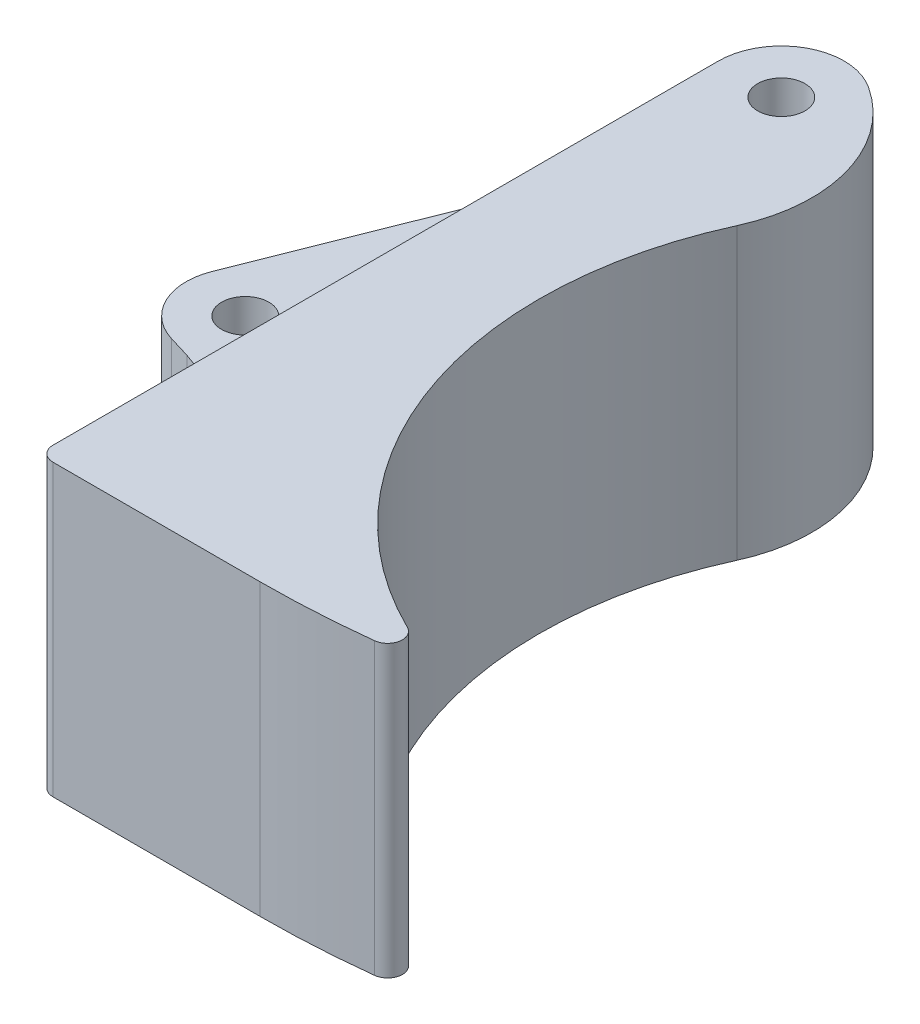
ISO-10303-21;
HEADER;
FILE_DESCRIPTION(('STEP AP214'),'2;1');
FILE_NAME('part.step','',(''),(''),'','','');
FILE_SCHEMA(('AUTOMOTIVE_DESIGN { 1 0 10303 214 1 1 1 1 }'));
ENDSEC;
DATA;
#1=APPLICATION_CONTEXT('core data for automotive mechanical design processes');
#2=APPLICATION_PROTOCOL_DEFINITION('international standard','automotive_design',2000,#1);
#3=PRODUCT_CONTEXT('',#1,'mechanical');
#4=PRODUCT('Part','Part','',(#3));
#5=PRODUCT_RELATED_PRODUCT_CATEGORY('part','',(#4));
#6=PRODUCT_DEFINITION_FORMATION('','',#4);
#7=PRODUCT_DEFINITION_CONTEXT('part definition',#1,'design');
#8=PRODUCT_DEFINITION('design','',#6,#7);
#9=PRODUCT_DEFINITION_SHAPE('','',#8);
#10=(LENGTH_UNIT() NAMED_UNIT(*) SI_UNIT(.MILLI.,.METRE.));
#11=(NAMED_UNIT(*) PLANE_ANGLE_UNIT() SI_UNIT($,.RADIAN.));
#12=(NAMED_UNIT(*) SI_UNIT($,.STERADIAN.) SOLID_ANGLE_UNIT());
#13=UNCERTAINTY_MEASURE_WITH_UNIT(LENGTH_MEASURE(1.E-05),#10,'distance_accuracy_value','');
#14=(GEOMETRIC_REPRESENTATION_CONTEXT(3) GLOBAL_UNCERTAINTY_ASSIGNED_CONTEXT((#13)) GLOBAL_UNIT_ASSIGNED_CONTEXT((#10,
#11,#12)) REPRESENTATION_CONTEXT('',''));
#15=CARTESIAN_POINT('',(0.,0.,0.));
#16=DIRECTION('',(0.,0.,1.));
#17=DIRECTION('',(1.,0.,0.));
#18=AXIS2_PLACEMENT_3D('',#15,#16,#17);
#19=CARTESIAN_POINT('',(0.,12.446,0.));
#20=DIRECTION('',(0.,1.,0.));
#21=DIRECTION('',(0.,0.,-1.));
#22=AXIS2_PLACEMENT_3D('',#19,#20,#21);
#23=PLANE('',#22);
#24=DIRECTION('',(-1.,0.,0.));
#25=VECTOR('',#24,1.);
#26=CARTESIAN_POINT('',(-5.39750000000001,12.446,58.42));
#27=LINE('',#26,#25);
#28=CARTESIAN_POINT('',(13.6525,12.446,58.42));
#29=VERTEX_POINT('',#28);
#30=CARTESIAN_POINT('',(-4.12750000000001,12.446,58.42));
#31=VERTEX_POINT('',#30);
#32=EDGE_CURVE('E203',#29,#31,#27,.T.);
#33=ORIENTED_EDGE('',*,*,#32,.F.);
#34=CARTESIAN_POINT('',(13.6525,12.446,-23.1899502882853));
#35=DIRECTION('',(0.,-1.,0.));
#36=DIRECTION('',(0.,0.,-1.));
#37=AXIS2_PLACEMENT_3D('',#34,#35,#36);
#38=CIRCLE('',#37,81.6099502882853);
#39=CARTESIAN_POINT('',(22.9595844996685,12.446,57.8875568525514));
#40=VERTEX_POINT('',#39);
#41=EDGE_CURVE('E201',#40,#29,#38,.T.);
#42=ORIENTED_EDGE('',*,*,#41,.F.);
#43=CARTESIAN_POINT('',(22.8147492525837,12.446,56.62584264117));
#44=DIRECTION('',(0.,-1.,0.));
#45=DIRECTION('',(0.,0.,-1.));
#46=AXIS2_PLACEMENT_3D('',#43,#44,#45);
#47=CIRCLE('',#46,1.27);
#48=CARTESIAN_POINT('',(23.3731145766902,12.446,55.485172590351));
#49=VERTEX_POINT('',#48);
#50=EDGE_CURVE('E257',#49,#40,#47,.T.);
#51=ORIENTED_EDGE('',*,*,#50,.F.);
#52=CARTESIAN_POINT('',(38.1,12.446,25.4));
#53=DIRECTION('',(0.,1.,0.));
#54=DIRECTION('',(0.,0.,-1.));
#55=AXIS2_PLACEMENT_3D('',#52,#53,#54);
#56=CIRCLE('',#55,33.49625);
#57=CARTESIAN_POINT('',(7.64307979127989,12.446,11.4581645590634));
#58=VERTEX_POINT('',#57);
#59=EDGE_CURVE('E199',#58,#49,#56,.T.);
#60=ORIENTED_EDGE('',*,*,#59,.F.);
#61=CARTESIAN_POINT('',(-3.90456768122061,12.446,6.1721606004144));
#62=DIRECTION('',(0.,-1.,0.));
#63=DIRECTION('',(0.,0.,-1.));
#64=AXIS2_PLACEMENT_3D('',#61,#62,#63);
#65=CIRCLE('',#64,12.7);
#66=CARTESIAN_POINT('',(3.06233772324981,12.446,-4.44632465338525));
#67=VERTEX_POINT('',#66);
#68=EDGE_CURVE('E237',#67,#58,#65,.T.);
#69=ORIENTED_EDGE('',*,*,#68,.F.);
#70=DIRECTION('',(0.836101201086587,0.,0.548575228698459));
#71=VECTOR('',#70,1.);
#72=CARTESIAN_POINT('',(2.96093479689993,12.446,-4.51285623286485));
#73=LINE('',#72,#71);
#74=CARTESIAN_POINT('',(2.96093479689993,12.446,-4.51285623286485));
#75=VERTEX_POINT('',#74);
#76=EDGE_CURVE('E196',#75,#67,#73,.T.);
#77=ORIENTED_EDGE('',*,*,#76,.F.);
#78=CARTESIAN_POINT('',(0.,12.446,0.));
#79=DIRECTION('',(0.,-1.,0.));
#80=DIRECTION('',(0.,0.,-1.));
#81=AXIS2_PLACEMENT_3D('',#78,#79,#80);
#82=CIRCLE('',#81,5.3975);
#83=CARTESIAN_POINT('',(-5.3975,12.446,0.));
#84=VERTEX_POINT('',#83);
#85=EDGE_CURVE('E192',#84,#75,#82,.T.);
#86=ORIENTED_EDGE('',*,*,#85,.F.);
#87=DIRECTION('',(0.,0.,-1.));
#88=VECTOR('',#87,1.);
#89=CARTESIAN_POINT('',(-5.39750000000001,12.446,58.42));
#90=LINE('',#89,#88);
#91=CARTESIAN_POINT('',(-5.39750000000001,12.446,57.15));
#92=VERTEX_POINT('',#91);
#93=EDGE_CURVE('E189',#92,#84,#90,.T.);
#94=ORIENTED_EDGE('',*,*,#93,.F.);
#95=CARTESIAN_POINT('',(-4.12750000000001,12.446,57.15));
#96=DIRECTION('',(0.,-1.,0.));
#97=DIRECTION('',(0.,0.,-1.));
#98=AXIS2_PLACEMENT_3D('',#95,#96,#97);
#99=CIRCLE('',#98,1.27);
#100=EDGE_CURVE('E259',#31,#92,#99,.T.);
#101=ORIENTED_EDGE('',*,*,#100,.F.);
#102=EDGE_LOOP('',(#33,#42,#51,#60,#69,#77,#86,#94,#101));
#103=FACE_BOUND('',#102,.T.);
#104=CARTESIAN_POINT('',(0.,12.446,0.));
#105=DIRECTION('',(0.,-1.,0.));
#106=DIRECTION('',(0.,0.,-1.));
#107=AXIS2_PLACEMENT_3D('',#104,#105,#106);
#108=CIRCLE('',#107,2.032);
#109=CARTESIAN_POINT('',(0.,12.446,-2.032));
#110=VERTEX_POINT('',#109);
#111=EDGE_CURVE('E183',#110,#110,#108,.T.);
#112=ORIENTED_EDGE('',*,*,#111,.T.);
#113=EDGE_LOOP('',(#112));
#114=FACE_BOUND('',#113,.T.);
#115=ADVANCED_FACE('F41',(#103,#114),#23,.T.);
#116=CARTESIAN_POINT('',(0.,-12.446,0.));
#117=DIRECTION('',(0.,1.,0.));
#118=DIRECTION('',(0.,0.,-1.));
#119=AXIS2_PLACEMENT_3D('',#116,#117,#118);
#120=PLANE('',#119);
#121=DIRECTION('',(0.,0.,-1.));
#122=VECTOR('',#121,1.);
#123=CARTESIAN_POINT('',(-5.39750000000001,-12.446,58.42));
#124=LINE('',#123,#122);
#125=CARTESIAN_POINT('',(-5.39750000000001,-12.446,57.15));
#126=VERTEX_POINT('',#125);
#127=CARTESIAN_POINT('',(-5.3975,-12.446,0.));
#128=VERTEX_POINT('',#127);
#129=EDGE_CURVE('E186',#126,#128,#124,.T.);
#130=ORIENTED_EDGE('',*,*,#129,.T.);
#131=CARTESIAN_POINT('',(0.,-12.446,0.));
#132=DIRECTION('',(0.,-1.,0.));
#133=DIRECTION('',(0.,0.,-1.));
#134=AXIS2_PLACEMENT_3D('',#131,#132,#133);
#135=CIRCLE('',#134,5.3975);
#136=CARTESIAN_POINT('',(2.96093479689993,-12.446,-4.51285623286485));
#137=VERTEX_POINT('',#136);
#138=EDGE_CURVE('E209',#128,#137,#135,.T.);
#139=ORIENTED_EDGE('',*,*,#138,.T.);
#140=DIRECTION('',(0.836101201086587,0.,0.548575228698459));
#141=VECTOR('',#140,1.);
#142=CARTESIAN_POINT('',(2.96093479689993,-12.446,-4.51285623286485));
#143=LINE('',#142,#141);
#144=CARTESIAN_POINT('',(3.06233772324981,-12.446,-4.44632465338525));
#145=VERTEX_POINT('',#144);
#146=EDGE_CURVE('E212',#137,#145,#143,.T.);
#147=ORIENTED_EDGE('',*,*,#146,.T.);
#148=CARTESIAN_POINT('',(-3.90456768122061,-12.446,6.1721606004144));
#149=DIRECTION('',(0.,-1.,0.));
#150=DIRECTION('',(0.,0.,-1.));
#151=AXIS2_PLACEMENT_3D('',#148,#149,#150);
#152=CIRCLE('',#151,12.7);
#153=CARTESIAN_POINT('',(7.64307979127989,-12.446,11.4581645590634));
#154=VERTEX_POINT('',#153);
#155=EDGE_CURVE('E232',#154,#145,#152,.F.);
#156=ORIENTED_EDGE('',*,*,#155,.F.);
#157=CARTESIAN_POINT('',(38.1,-12.446,25.4));
#158=DIRECTION('',(0.,1.,0.));
#159=DIRECTION('',(0.,0.,-1.));
#160=AXIS2_PLACEMENT_3D('',#157,#158,#159);
#161=CIRCLE('',#160,33.49625);
#162=CARTESIAN_POINT('',(23.3731145766902,-12.446,55.485172590351));
#163=VERTEX_POINT('',#162);
#164=EDGE_CURVE('E215',#154,#163,#161,.T.);
#165=ORIENTED_EDGE('',*,*,#164,.T.);
#166=CARTESIAN_POINT('',(22.8147492525837,-12.446,56.62584264117));
#167=DIRECTION('',(0.,-1.,0.));
#168=DIRECTION('',(0.,0.,-1.));
#169=AXIS2_PLACEMENT_3D('',#166,#167,#168);
#170=CIRCLE('',#169,1.27);
#171=CARTESIAN_POINT('',(22.9595844996685,-12.446,57.8875568525514));
#172=VERTEX_POINT('',#171);
#173=EDGE_CURVE('E250',#172,#163,#170,.F.);
#174=ORIENTED_EDGE('',*,*,#173,.F.);
#175=CARTESIAN_POINT('',(13.6525,-12.446,-23.1899502882853));
#176=DIRECTION('',(0.,-1.,0.));
#177=DIRECTION('',(0.,0.,-1.));
#178=AXIS2_PLACEMENT_3D('',#175,#176,#177);
#179=CIRCLE('',#178,81.6099502882853);
#180=CARTESIAN_POINT('',(13.6525,-12.446,58.42));
#181=VERTEX_POINT('',#180);
#182=EDGE_CURVE('E218',#172,#181,#179,.T.);
#183=ORIENTED_EDGE('',*,*,#182,.T.);
#184=DIRECTION('',(-1.,0.,0.));
#185=VECTOR('',#184,1.);
#186=CARTESIAN_POINT('',(-5.39750000000001,-12.446,58.42));
#187=LINE('',#186,#185);
#188=CARTESIAN_POINT('',(-4.12750000000001,-12.446,58.42));
#189=VERTEX_POINT('',#188);
#190=EDGE_CURVE('E193',#181,#189,#187,.T.);
#191=ORIENTED_EDGE('',*,*,#190,.T.);
#192=CARTESIAN_POINT('',(-4.12750000000001,-12.446,57.15));
#193=DIRECTION('',(0.,-1.,0.));
#194=DIRECTION('',(0.,0.,-1.));
#195=AXIS2_PLACEMENT_3D('',#192,#193,#194);
#196=CIRCLE('',#195,1.27);
#197=EDGE_CURVE('E252',#126,#189,#196,.F.);
#198=ORIENTED_EDGE('',*,*,#197,.F.);
#199=EDGE_LOOP('',(#130,#139,#147,#156,#165,#174,#183,#191,#198));
#200=FACE_BOUND('',#199,.T.);
#201=CARTESIAN_POINT('',(0.,-12.446,0.));
#202=DIRECTION('',(0.,-1.,0.));
#203=DIRECTION('',(0.,0.,-1.));
#204=AXIS2_PLACEMENT_3D('',#201,#202,#203);
#205=CIRCLE('',#204,2.032);
#206=CARTESIAN_POINT('',(0.,-12.446,-2.032));
#207=VERTEX_POINT('',#206);
#208=EDGE_CURVE('E151',#207,#207,#205,.T.);
#209=ORIENTED_EDGE('',*,*,#208,.F.);
#210=EDGE_LOOP('',(#209));
#211=FACE_BOUND('',#210,.T.);
#212=ADVANCED_FACE('F267',(#200,#211),#120,.F.);
#213=CARTESIAN_POINT('',(-5.39750000000001,12.446,58.42));
#214=DIRECTION('',(1.,0.,0.));
#215=DIRECTION('',(0.,0.,1.));
#216=AXIS2_PLACEMENT_3D('',#213,#214,#215);
#217=PLANE('',#216);
#218=ORIENTED_EDGE('',*,*,#93,.T.);
#219=DIRECTION('',(0.,-1.,0.));
#220=VECTOR('',#219,1.);
#221=CARTESIAN_POINT('',(-5.3975,12.446,0.));
#222=LINE('',#221,#220);
#223=CARTESIAN_POINT('',(-5.3975,6.19125,0.));
#224=VERTEX_POINT('',#223);
#225=EDGE_CURVE('E227',#84,#224,#222,.T.);
#226=ORIENTED_EDGE('',*,*,#225,.T.);
#227=DIRECTION('',(0.,0.,1.));
#228=VECTOR('',#227,1.);
#229=CARTESIAN_POINT('',(-5.39750000000001,6.19125,40.64));
#230=LINE('',#229,#228);
#231=CARTESIAN_POINT('',(-5.39750000000001,6.19125,48.1752390496232));
#232=VERTEX_POINT('',#231);
#233=EDGE_CURVE('E160',#224,#232,#230,.T.);
#234=ORIENTED_EDGE('',*,*,#233,.T.);
#235=DIRECTION('',(0.,-1.,0.));
#236=VECTOR('',#235,1.);
#237=CARTESIAN_POINT('',(-5.39750000000001,6.19125,48.1752390496232));
#238=LINE('',#237,#236);
#239=CARTESIAN_POINT('',(-5.39750000000001,-6.19125,48.1752390496232));
#240=VERTEX_POINT('',#239);
#241=EDGE_CURVE('E241',#240,#232,#238,.F.);
#242=ORIENTED_EDGE('',*,*,#241,.F.);
#243=DIRECTION('',(0.,0.,1.));
#244=VECTOR('',#243,1.);
#245=CARTESIAN_POINT('',(-5.39750000000001,-6.19125,40.64));
#246=LINE('',#245,#244);
#247=CARTESIAN_POINT('',(-5.3975,-6.19125,0.));
#248=VERTEX_POINT('',#247);
#249=EDGE_CURVE('E171',#248,#240,#246,.T.);
#250=ORIENTED_EDGE('',*,*,#249,.F.);
#251=EDGE_CURVE('E226',#248,#128,#222,.T.);
#252=ORIENTED_EDGE('',*,*,#251,.T.);
#253=ORIENTED_EDGE('',*,*,#129,.F.);
#254=DIRECTION('',(0.,-1.,0.));
#255=VECTOR('',#254,1.);
#256=CARTESIAN_POINT('',(-5.39750000000001,12.446,57.15));
#257=LINE('',#256,#255);
#258=EDGE_CURVE('E248',#92,#126,#257,.T.);
#259=ORIENTED_EDGE('',*,*,#258,.F.);
#260=EDGE_LOOP('',(#218,#226,#234,#242,#250,#252,#253,#259));
#261=FACE_BOUND('',#260,.T.);
#262=ADVANCED_FACE('F286',(#261),#217,.F.);
#263=CARTESIAN_POINT('',(0.,12.446,0.));
#264=DIRECTION('',(0.,-1.,0.));
#265=DIRECTION('',(0.,0.,1.));
#266=AXIS2_PLACEMENT_3D('',#263,#264,#265);
#267=CYLINDRICAL_SURFACE('',#266,5.3975);
#268=ORIENTED_EDGE('',*,*,#138,.F.);
#269=ORIENTED_EDGE('',*,*,#251,.F.);
#270=DIRECTION('',(0.,-1.,0.));
#271=VECTOR('',#270,1.);
#272=CARTESIAN_POINT('',(-5.3975,6.19125,0.));
#273=LINE('',#272,#271);
#274=EDGE_CURVE('E167',#224,#248,#273,.T.);
#275=ORIENTED_EDGE('',*,*,#274,.F.);
#276=ORIENTED_EDGE('',*,*,#225,.F.);
#277=ORIENTED_EDGE('',*,*,#85,.T.);
#278=DIRECTION('',(0.,-1.,0.));
#279=VECTOR('',#278,1.);
#280=CARTESIAN_POINT('',(2.96093479689993,12.446,-4.51285623286485));
#281=LINE('',#280,#279);
#282=EDGE_CURVE('E224',#75,#137,#281,.T.);
#283=ORIENTED_EDGE('',*,*,#282,.T.);
#284=EDGE_LOOP('',(#268,#269,#275,#276,#277,#283));
#285=FACE_BOUND('',#284,.T.);
#286=ADVANCED_FACE('F293',(#285),#267,.T.);
#287=CARTESIAN_POINT('',(2.96093479689993,12.446,-4.51285623286485));
#288=DIRECTION('',(-0.548575228698459,0.,0.836101201086587));
#289=DIRECTION('',(-0.836101201086587,0.,-0.548575228698459));
#290=AXIS2_PLACEMENT_3D('',#287,#288,#289);
#291=PLANE('',#290);
#292=ORIENTED_EDGE('',*,*,#146,.F.);
#293=ORIENTED_EDGE('',*,*,#282,.F.);
#294=ORIENTED_EDGE('',*,*,#76,.T.);
#295=DIRECTION('',(0.,-1.,0.));
#296=VECTOR('',#295,1.);
#297=CARTESIAN_POINT('',(3.06233772324981,12.446,-4.44632465338525));
#298=LINE('',#297,#296);
#299=EDGE_CURVE('E235',#145,#67,#298,.F.);
#300=ORIENTED_EDGE('',*,*,#299,.F.);
#301=EDGE_LOOP('',(#292,#293,#294,#300));
#302=FACE_BOUND('',#301,.T.);
#303=ADVANCED_FACE('F296',(#302),#291,.F.);
#304=CARTESIAN_POINT('',(38.1,12.446,25.4));
#305=DIRECTION('',(0.,-1.,0.));
#306=DIRECTION('',(0.,0.,1.));
#307=AXIS2_PLACEMENT_3D('',#304,#305,#306);
#308=CYLINDRICAL_SURFACE('',#307,33.49625);
#309=ORIENTED_EDGE('',*,*,#164,.F.);
#310=DIRECTION('',(0.,-1.,0.));
#311=VECTOR('',#310,1.);
#312=CARTESIAN_POINT('',(7.64307979127989,12.446,11.4581645590634));
#313=LINE('',#312,#311);
#314=EDGE_CURVE('E230',#58,#154,#313,.T.);
#315=ORIENTED_EDGE('',*,*,#314,.F.);
#316=ORIENTED_EDGE('',*,*,#59,.T.);
#317=DIRECTION('',(0.,-1.,0.));
#318=VECTOR('',#317,1.);
#319=CARTESIAN_POINT('',(23.3731145766902,12.446,55.485172590351));
#320=LINE('',#319,#318);
#321=EDGE_CURVE('E11',#163,#49,#320,.F.);
#322=ORIENTED_EDGE('',*,*,#321,.F.);
#323=EDGE_LOOP('',(#309,#315,#316,#322));
#324=FACE_BOUND('',#323,.T.);
#325=ADVANCED_FACE('F272',(#324),#308,.F.);
#326=CARTESIAN_POINT('',(13.6525,12.446,-23.1899502882853));
#327=DIRECTION('',(0.,-1.,0.));
#328=DIRECTION('',(0.,0.,1.));
#329=AXIS2_PLACEMENT_3D('',#326,#327,#328);
#330=CYLINDRICAL_SURFACE('',#329,81.6099502882853);
#331=ORIENTED_EDGE('',*,*,#41,.T.);
#332=DIRECTION('',(0.,-1.,0.));
#333=VECTOR('',#332,1.);
#334=CARTESIAN_POINT('',(13.6525,12.446,58.42));
#335=LINE('',#334,#333);
#336=EDGE_CURVE('E206',#29,#181,#335,.T.);
#337=ORIENTED_EDGE('',*,*,#336,.T.);
#338=ORIENTED_EDGE('',*,*,#182,.F.);
#339=DIRECTION('',(0.,-1.,0.));
#340=VECTOR('',#339,1.);
#341=CARTESIAN_POINT('',(22.9595844996685,12.446,57.8875568525514));
#342=LINE('',#341,#340);
#343=EDGE_CURVE('E49',#40,#172,#342,.T.);
#344=ORIENTED_EDGE('',*,*,#343,.F.);
#345=EDGE_LOOP('',(#331,#337,#338,#344));
#346=FACE_BOUND('',#345,.T.);
#347=ADVANCED_FACE('F264',(#346),#330,.T.);
#348=CARTESIAN_POINT('',(-5.39750000000001,12.446,58.42));
#349=DIRECTION('',(0.,0.,-1.));
#350=DIRECTION('',(1.,0.,0.));
#351=AXIS2_PLACEMENT_3D('',#348,#349,#350);
#352=PLANE('',#351);
#353=ORIENTED_EDGE('',*,*,#190,.F.);
#354=ORIENTED_EDGE('',*,*,#336,.F.);
#355=ORIENTED_EDGE('',*,*,#32,.T.);
#356=DIRECTION('',(0.,-1.,0.));
#357=VECTOR('',#356,1.);
#358=CARTESIAN_POINT('',(-4.12750000000001,12.446,58.42));
#359=LINE('',#358,#357);
#360=EDGE_CURVE('E255',#189,#31,#359,.F.);
#361=ORIENTED_EDGE('',*,*,#360,.F.);
#362=EDGE_LOOP('',(#353,#354,#355,#361));
#363=FACE_BOUND('',#362,.T.);
#364=ADVANCED_FACE('F281',(#363),#352,.F.);
#365=CARTESIAN_POINT('',(0.,12.446,0.));
#366=DIRECTION('',(0.,-1.,0.));
#367=DIRECTION('',(0.,0.,1.));
#368=AXIS2_PLACEMENT_3D('',#365,#366,#367);
#369=CYLINDRICAL_SURFACE('',#368,2.032);
#370=ORIENTED_EDGE('',*,*,#111,.F.);
#371=EDGE_LOOP('',(#370));
#372=FACE_BOUND('',#371,.T.);
#373=ORIENTED_EDGE('',*,*,#208,.T.);
#374=EDGE_LOOP('',(#373));
#375=FACE_BOUND('',#374,.T.);
#376=ADVANCED_FACE('F335',(#372,#375),#369,.F.);
#377=CARTESIAN_POINT('',(-3.90456768122061,12.446,6.1721606004144));
#378=DIRECTION('',(0.,-1.,0.));
#379=DIRECTION('',(0.,0.,1.));
#380=AXIS2_PLACEMENT_3D('',#377,#378,#379);
#381=CYLINDRICAL_SURFACE('',#380,12.7);
#382=ORIENTED_EDGE('',*,*,#68,.T.);
#383=ORIENTED_EDGE('',*,*,#314,.T.);
#384=ORIENTED_EDGE('',*,*,#155,.T.);
#385=ORIENTED_EDGE('',*,*,#299,.T.);
#386=EDGE_LOOP('',(#382,#383,#384,#385));
#387=FACE_BOUND('',#386,.T.);
#388=ADVANCED_FACE('F299',(#387),#381,.T.);
#389=CARTESIAN_POINT('',(-13.0175,6.19125,33.02));
#390=DIRECTION('',(0.,1.,0.));
#391=DIRECTION('',(0.,0.,-1.));
#392=AXIS2_PLACEMENT_3D('',#389,#390,#391);
#393=PLANE('',#392);
#394=ORIENTED_EDGE('',*,*,#233,.F.);
#395=DIRECTION('',(0.36838605547651,0.,-0.929672907064876));
#396=VECTOR('',#395,1.);
#397=CARTESIAN_POINT('',(-5.3975,6.19125,0.));
#398=LINE('',#397,#396);
#399=CARTESIAN_POINT('',(-17.7402383678896,6.19125,31.1485988381793));
#400=VERTEX_POINT('',#399);
#401=EDGE_CURVE('E165',#400,#224,#398,.T.);
#402=ORIENTED_EDGE('',*,*,#401,.F.);
#403=CARTESIAN_POINT('',(-13.0175,6.19125,33.02));
#404=DIRECTION('',(0.,-1.,0.));
#405=DIRECTION('',(0.,0.,-1.));
#406=AXIS2_PLACEMENT_3D('',#403,#404,#405);
#407=CIRCLE('',#406,5.08);
#408=CARTESIAN_POINT('',(-14.4921032541353,6.19125,37.8812699208019));
#409=VERTEX_POINT('',#408);
#410=EDGE_CURVE('E144',#409,#400,#407,.T.);
#411=ORIENTED_EDGE('',*,*,#410,.F.);
#412=DIRECTION('',(-0.956942897795657,0.,-0.29027623112899));
#413=VECTOR('',#412,1.);
#414=CARTESIAN_POINT('',(-5.39750000000001,6.19125,40.64));
#415=LINE('',#414,#413);
#416=CARTESIAN_POINT('',(-12.6082934917295,6.19125,38.4526992080194));
#417=VERTEX_POINT('',#416);
#418=EDGE_CURVE('E155',#417,#409,#415,.T.);
#419=ORIENTED_EDGE('',*,*,#418,.F.);
#420=CARTESIAN_POINT('',(-15.5575,6.19125,48.1752390496232));
#421=DIRECTION('',(0.,-1.,0.));
#422=DIRECTION('',(0.,0.,-1.));
#423=AXIS2_PLACEMENT_3D('',#420,#421,#422);
#424=CIRCLE('',#423,10.16);
#425=EDGE_CURVE('E246',#232,#417,#424,.F.);
#426=ORIENTED_EDGE('',*,*,#425,.F.);
#427=EDGE_LOOP('',(#394,#402,#411,#419,#426));
#428=FACE_BOUND('',#427,.T.);
#429=CARTESIAN_POINT('',(-13.0175,6.19125,33.02));
#430=DIRECTION('',(0.,-1.,0.));
#431=DIRECTION('',(0.,0.,-1.));
#432=AXIS2_PLACEMENT_3D('',#429,#430,#431);
#433=CIRCLE('',#432,2.032);
#434=CARTESIAN_POINT('',(-13.0175,6.19125,30.988));
#435=VERTEX_POINT('',#434);
#436=EDGE_CURVE('E175',#435,#435,#433,.T.);
#437=ORIENTED_EDGE('',*,*,#436,.T.);
#438=EDGE_LOOP('',(#437));
#439=FACE_BOUND('',#438,.T.);
#440=ADVANCED_FACE('F163',(#428,#439),#393,.T.);
#441=CARTESIAN_POINT('',(-13.0175,-6.19125,33.02));
#442=DIRECTION('',(0.,1.,0.));
#443=DIRECTION('',(0.,0.,-1.));
#444=AXIS2_PLACEMENT_3D('',#441,#442,#443);
#445=PLANE('',#444);
#446=ORIENTED_EDGE('',*,*,#249,.T.);
#447=CARTESIAN_POINT('',(-15.5575,-6.19125,48.1752390496232));
#448=DIRECTION('',(0.,-1.,0.));
#449=DIRECTION('',(0.,0.,-1.));
#450=AXIS2_PLACEMENT_3D('',#447,#448,#449);
#451=CIRCLE('',#450,10.16);
#452=CARTESIAN_POINT('',(-12.6082934917295,-6.19125,38.4526992080194));
#453=VERTEX_POINT('',#452);
#454=EDGE_CURVE('E244',#453,#240,#451,.T.);
#455=ORIENTED_EDGE('',*,*,#454,.F.);
#456=DIRECTION('',(-0.956942897795657,0.,-0.29027623112899));
#457=VECTOR('',#456,1.);
#458=CARTESIAN_POINT('',(-5.39750000000001,-6.19125,40.64));
#459=LINE('',#458,#457);
#460=CARTESIAN_POINT('',(-14.4921032541353,-6.19125,37.8812699208019));
#461=VERTEX_POINT('',#460);
#462=EDGE_CURVE('E174',#453,#461,#459,.T.);
#463=ORIENTED_EDGE('',*,*,#462,.T.);
#464=CARTESIAN_POINT('',(-13.0175,-6.19125,33.02));
#465=DIRECTION('',(0.,-1.,0.));
#466=DIRECTION('',(0.,0.,-1.));
#467=AXIS2_PLACEMENT_3D('',#464,#465,#466);
#468=CIRCLE('',#467,5.08);
#469=CARTESIAN_POINT('',(-17.7402383678896,-6.19125,31.1485988381793));
#470=VERTEX_POINT('',#469);
#471=EDGE_CURVE('E147',#461,#470,#468,.T.);
#472=ORIENTED_EDGE('',*,*,#471,.T.);
#473=DIRECTION('',(0.36838605547651,0.,-0.929672907064876));
#474=VECTOR('',#473,1.);
#475=CARTESIAN_POINT('',(-5.3975,-6.19125,0.));
#476=LINE('',#475,#474);
#477=EDGE_CURVE('E178',#470,#248,#476,.T.);
#478=ORIENTED_EDGE('',*,*,#477,.T.);
#479=EDGE_LOOP('',(#446,#455,#463,#472,#478));
#480=FACE_BOUND('',#479,.T.);
#481=CARTESIAN_POINT('',(-13.0175,-6.19125,33.02));
#482=DIRECTION('',(0.,-1.,0.));
#483=DIRECTION('',(0.,0.,-1.));
#484=AXIS2_PLACEMENT_3D('',#481,#482,#483);
#485=CIRCLE('',#484,2.032);
#486=CARTESIAN_POINT('',(-13.0175,-6.19125,30.988));
#487=VERTEX_POINT('',#486);
#488=EDGE_CURVE('E303',#487,#487,#485,.T.);
#489=ORIENTED_EDGE('',*,*,#488,.F.);
#490=EDGE_LOOP('',(#489));
#491=FACE_BOUND('',#490,.T.);
#492=ADVANCED_FACE('F317',(#480,#491),#445,.F.);
#493=CARTESIAN_POINT('',(-5.39750000000001,6.19125,40.64));
#494=DIRECTION('',(0.29027623112899,0.,-0.956942897795657));
#495=DIRECTION('',(0.956942897795657,0.,0.290276231128991));
#496=AXIS2_PLACEMENT_3D('',#493,#494,#495);
#497=PLANE('',#496);
#498=ORIENTED_EDGE('',*,*,#418,.T.);
#499=DIRECTION('',(0.,-1.,0.));
#500=VECTOR('',#499,1.);
#501=CARTESIAN_POINT('',(-14.4921032541353,6.19125,37.8812699208019));
#502=LINE('',#501,#500);
#503=EDGE_CURVE('E140',#409,#461,#502,.T.);
#504=ORIENTED_EDGE('',*,*,#503,.T.);
#505=ORIENTED_EDGE('',*,*,#462,.F.);
#506=DIRECTION('',(0.,-1.,0.));
#507=VECTOR('',#506,1.);
#508=CARTESIAN_POINT('',(-12.6082934917295,-6.19125,38.4526992080194));
#509=LINE('',#508,#507);
#510=EDGE_CURVE('E157',#417,#453,#509,.T.);
#511=ORIENTED_EDGE('',*,*,#510,.F.);
#512=EDGE_LOOP('',(#498,#504,#505,#511));
#513=FACE_BOUND('',#512,.T.);
#514=ADVANCED_FACE('F156',(#513),#497,.F.);
#515=CARTESIAN_POINT('',(-13.0175,6.19125,33.02));
#516=DIRECTION('',(0.,-1.,0.));
#517=DIRECTION('',(0.,0.,1.));
#518=AXIS2_PLACEMENT_3D('',#515,#516,#517);
#519=CYLINDRICAL_SURFACE('',#518,5.08);
#520=ORIENTED_EDGE('',*,*,#471,.F.);
#521=ORIENTED_EDGE('',*,*,#503,.F.);
#522=ORIENTED_EDGE('',*,*,#410,.T.);
#523=DIRECTION('',(0.,-1.,0.));
#524=VECTOR('',#523,1.);
#525=CARTESIAN_POINT('',(-17.7402383678896,6.19125,31.1485988381793));
#526=LINE('',#525,#524);
#527=EDGE_CURVE('E152',#400,#470,#526,.T.);
#528=ORIENTED_EDGE('',*,*,#527,.T.);
#529=EDGE_LOOP('',(#520,#521,#522,#528));
#530=FACE_BOUND('',#529,.T.);
#531=ADVANCED_FACE('F142',(#530),#519,.T.);
#532=CARTESIAN_POINT('',(-5.3975,6.19125,0.));
#533=DIRECTION('',(0.929672907064876,0.,0.36838605547651));
#534=DIRECTION('',(-0.36838605547651,0.,0.929672907064876));
#535=AXIS2_PLACEMENT_3D('',#532,#533,#534);
#536=PLANE('',#535);
#537=ORIENTED_EDGE('',*,*,#477,.F.);
#538=ORIENTED_EDGE('',*,*,#527,.F.);
#539=ORIENTED_EDGE('',*,*,#401,.T.);
#540=ORIENTED_EDGE('',*,*,#274,.T.);
#541=EDGE_LOOP('',(#537,#538,#539,#540));
#542=FACE_BOUND('',#541,.T.);
#543=ADVANCED_FACE('F313',(#542),#536,.F.);
#544=CARTESIAN_POINT('',(-13.0175,6.19125,33.02));
#545=DIRECTION('',(0.,-1.,0.));
#546=DIRECTION('',(0.,0.,1.));
#547=AXIS2_PLACEMENT_3D('',#544,#545,#546);
#548=CYLINDRICAL_SURFACE('',#547,2.032);
#549=ORIENTED_EDGE('',*,*,#436,.F.);
#550=EDGE_LOOP('',(#549));
#551=FACE_BOUND('',#550,.T.);
#552=ORIENTED_EDGE('',*,*,#488,.T.);
#553=EDGE_LOOP('',(#552));
#554=FACE_BOUND('',#553,.T.);
#555=ADVANCED_FACE('F309',(#551,#554),#548,.F.);
#556=CARTESIAN_POINT('',(-15.5575,6.19125,48.1752390496232));
#557=DIRECTION('',(0.,1.,0.));
#558=DIRECTION('',(0.,0.,-1.));
#559=AXIS2_PLACEMENT_3D('',#556,#557,#558);
#560=CYLINDRICAL_SURFACE('',#559,10.16);
#561=ORIENTED_EDGE('',*,*,#425,.T.);
#562=ORIENTED_EDGE('',*,*,#510,.T.);
#563=ORIENTED_EDGE('',*,*,#454,.T.);
#564=ORIENTED_EDGE('',*,*,#241,.T.);
#565=EDGE_LOOP('',(#561,#562,#563,#564));
#566=FACE_BOUND('',#565,.T.);
#567=ADVANCED_FACE('F312',(#566),#560,.F.);
#568=CARTESIAN_POINT('',(-4.12750000000001,12.446,57.15));
#569=DIRECTION('',(0.,-1.,0.));
#570=DIRECTION('',(0.,0.,1.));
#571=AXIS2_PLACEMENT_3D('',#568,#569,#570);
#572=CYLINDRICAL_SURFACE('',#571,1.27);
#573=ORIENTED_EDGE('',*,*,#100,.T.);
#574=ORIENTED_EDGE('',*,*,#258,.T.);
#575=ORIENTED_EDGE('',*,*,#197,.T.);
#576=ORIENTED_EDGE('',*,*,#360,.T.);
#577=EDGE_LOOP('',(#573,#574,#575,#576));
#578=FACE_BOUND('',#577,.T.);
#579=ADVANCED_FACE('F352',(#578),#572,.T.);
#580=CARTESIAN_POINT('',(22.8147492525837,12.446,56.62584264117));
#581=DIRECTION('',(0.,1.,0.));
#582=DIRECTION('',(0.,0.,-1.));
#583=AXIS2_PLACEMENT_3D('',#580,#581,#582);
#584=CYLINDRICAL_SURFACE('',#583,1.27);
#585=ORIENTED_EDGE('',*,*,#50,.T.);
#586=ORIENTED_EDGE('',*,*,#343,.T.);
#587=ORIENTED_EDGE('',*,*,#173,.T.);
#588=ORIENTED_EDGE('',*,*,#321,.T.);
#589=EDGE_LOOP('',(#585,#586,#587,#588));
#590=FACE_BOUND('',#589,.T.);
#591=ADVANCED_FACE('F43',(#590),#584,.T.);
#592=CLOSED_SHELL('',(#115,#212,#262,#286,#303,#325,#347,#364,#376,#388,#440,#492,#514,#531,
#543,#555,#567,#579,#591));
#593=MANIFOLD_SOLID_BREP('B2',#592);
#594=ADVANCED_BREP_SHAPE_REPRESENTATION('',(#18,#593),#14);
#595=SHAPE_DEFINITION_REPRESENTATION(#9,#594);
ENDSEC;
END-ISO-10303-21;
